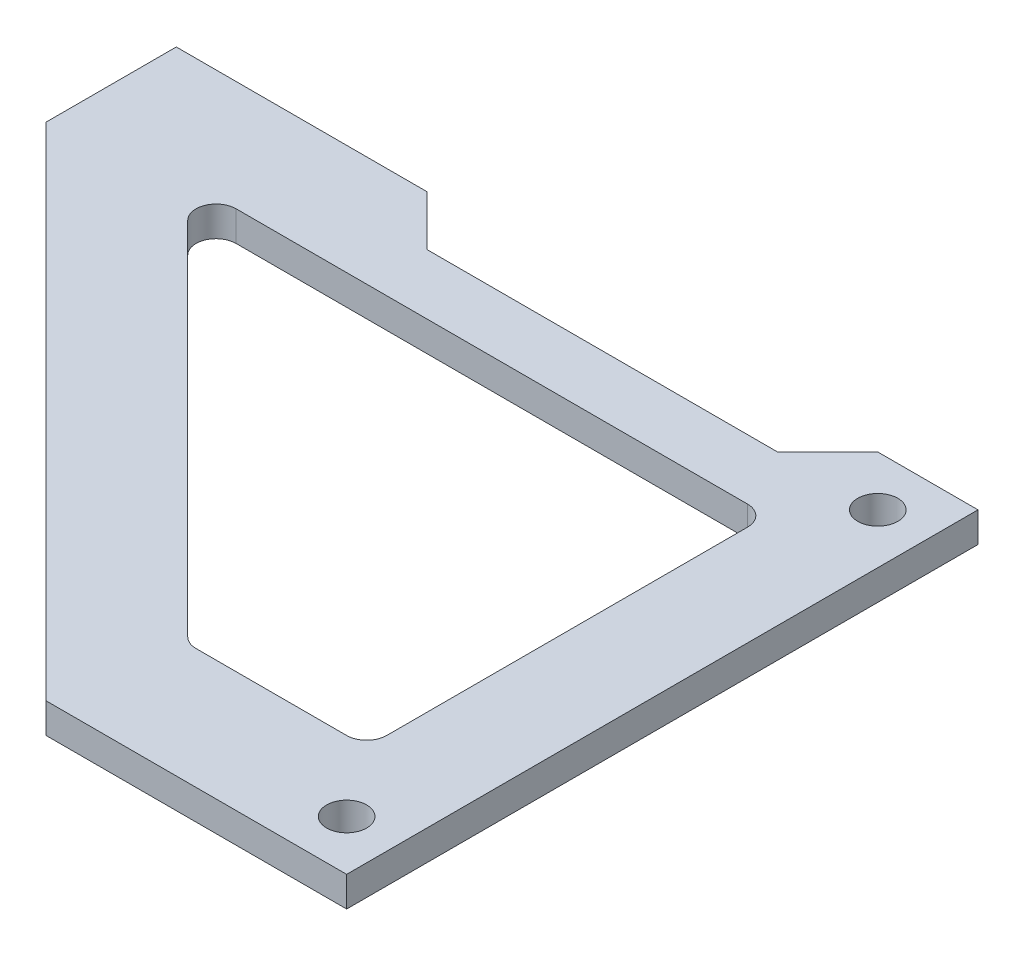
ISO-10303-21;
HEADER;
FILE_DESCRIPTION(('STEP AP214'),'2;1');
FILE_NAME('part.step','',(''),(''),'','','');
FILE_SCHEMA(('AUTOMOTIVE_DESIGN { 1 0 10303 214 1 1 1 1 }'));
ENDSEC;
DATA;
#1=APPLICATION_CONTEXT('core data for automotive mechanical design processes');
#2=APPLICATION_PROTOCOL_DEFINITION('international standard','automotive_design',2000,#1);
#3=PRODUCT_CONTEXT('',#1,'mechanical');
#4=PRODUCT('Part','Part','',(#3));
#5=PRODUCT_RELATED_PRODUCT_CATEGORY('part','',(#4));
#6=PRODUCT_DEFINITION_FORMATION('','',#4);
#7=PRODUCT_DEFINITION_CONTEXT('part definition',#1,'design');
#8=PRODUCT_DEFINITION('design','',#6,#7);
#9=PRODUCT_DEFINITION_SHAPE('','',#8);
#10=(LENGTH_UNIT() NAMED_UNIT(*) SI_UNIT(.MILLI.,.METRE.));
#11=(NAMED_UNIT(*) PLANE_ANGLE_UNIT() SI_UNIT($,.RADIAN.));
#12=(NAMED_UNIT(*) SI_UNIT($,.STERADIAN.) SOLID_ANGLE_UNIT());
#13=UNCERTAINTY_MEASURE_WITH_UNIT(LENGTH_MEASURE(1.E-05),#10,'distance_accuracy_value','');
#14=(GEOMETRIC_REPRESENTATION_CONTEXT(3) GLOBAL_UNCERTAINTY_ASSIGNED_CONTEXT((#13)) GLOBAL_UNIT_ASSIGNED_CONTEXT((#10,
#11,#12)) REPRESENTATION_CONTEXT('',''));
#15=CARTESIAN_POINT('',(0.,0.,0.));
#16=DIRECTION('',(0.,0.,1.));
#17=DIRECTION('',(1.,0.,0.));
#18=AXIS2_PLACEMENT_3D('',#15,#16,#17);
#19=CARTESIAN_POINT('',(-140.,3.,-31.5));
#20=DIRECTION('',(0.,0.,1.));
#21=DIRECTION('',(1.,0.,0.));
#22=AXIS2_PLACEMENT_3D('',#19,#20,#21);
#23=PLANE('',#22);
#24=DIRECTION('',(0.,1.,0.));
#25=VECTOR('',#24,1.);
#26=CARTESIAN_POINT('',(-115.,-7.,-31.5));
#27=LINE('',#26,#25);
#28=CARTESIAN_POINT('',(-115.,0.,-31.5));
#29=VERTEX_POINT('',#28);
#30=CARTESIAN_POINT('',(-115.,3.,-31.5));
#31=VERTEX_POINT('',#30);
#32=EDGE_CURVE('E161',#29,#31,#27,.T.);
#33=ORIENTED_EDGE('',*,*,#32,.F.);
#34=DIRECTION('',(-1.,0.,0.));
#35=VECTOR('',#34,1.);
#36=CARTESIAN_POINT('',(-140.,0.,-31.5));
#37=LINE('',#36,#35);
#38=CARTESIAN_POINT('',(-140.,0.,-31.5));
#39=VERTEX_POINT('',#38);
#40=EDGE_CURVE('E210',#29,#39,#37,.T.);
#41=ORIENTED_EDGE('',*,*,#40,.T.);
#42=DIRECTION('',(0.,-1.,0.));
#43=VECTOR('',#42,1.);
#44=CARTESIAN_POINT('',(-140.,3.,-31.5));
#45=LINE('',#44,#43);
#46=CARTESIAN_POINT('',(-140.,3.,-31.5));
#47=VERTEX_POINT('',#46);
#48=EDGE_CURVE('E188',#47,#39,#45,.T.);
#49=ORIENTED_EDGE('',*,*,#48,.F.);
#50=DIRECTION('',(-1.,0.,0.));
#51=VECTOR('',#50,1.);
#52=CARTESIAN_POINT('',(-140.,3.,-31.5));
#53=LINE('',#52,#51);
#54=EDGE_CURVE('E178',#31,#47,#53,.T.);
#55=ORIENTED_EDGE('',*,*,#54,.F.);
#56=EDGE_LOOP('',(#33,#41,#49,#55));
#57=FACE_BOUND('',#56,.T.);
#58=ADVANCED_FACE('F41',(#57),#23,.F.);
#59=CARTESIAN_POINT('',(-60.,0.,-31.5));
#60=VERTEX_POINT('',#59);
#61=CARTESIAN_POINT('',(-70.,0.,-31.5));
#62=VERTEX_POINT('',#61);
#63=EDGE_CURVE('E204',#60,#62,#37,.T.);
#64=ORIENTED_EDGE('',*,*,#63,.T.);
#65=DIRECTION('',(0.,1.,0.));
#66=VECTOR('',#65,1.);
#67=CARTESIAN_POINT('',(-70.,-7.,-31.5));
#68=LINE('',#67,#66);
#69=CARTESIAN_POINT('',(-70.,3.,-31.5));
#70=VERTEX_POINT('',#69);
#71=EDGE_CURVE('E304',#62,#70,#68,.T.);
#72=ORIENTED_EDGE('',*,*,#71,.T.);
#73=CARTESIAN_POINT('',(-60.,3.,-31.5));
#74=VERTEX_POINT('',#73);
#75=EDGE_CURVE('E186',#74,#70,#53,.T.);
#76=ORIENTED_EDGE('',*,*,#75,.F.);
#77=DIRECTION('',(0.,1.,0.));
#78=VECTOR('',#77,1.);
#79=CARTESIAN_POINT('',(-60.,-7.,-31.5));
#80=LINE('',#79,#78);
#81=EDGE_CURVE('E311',#60,#74,#80,.T.);
#82=ORIENTED_EDGE('',*,*,#81,.F.);
#83=EDGE_LOOP('',(#64,#72,#76,#82));
#84=FACE_BOUND('',#83,.T.);
#85=ADVANCED_FACE('F360',(#84),#23,.F.);
#86=CARTESIAN_POINT('',(-140.,3.,31.5));
#87=DIRECTION('',(0.,0.,-1.));
#88=DIRECTION('',(-1.,0.,0.));
#89=AXIS2_PLACEMENT_3D('',#86,#87,#88);
#90=PLANE('',#89);
#91=DIRECTION('',(1.,0.,0.));
#92=VECTOR('',#91,1.);
#93=CARTESIAN_POINT('',(-140.,0.,31.5));
#94=LINE('',#93,#92);
#95=CARTESIAN_POINT('',(-90.,0.,31.5));
#96=VERTEX_POINT('',#95);
#97=CARTESIAN_POINT('',(-60.,0.,31.5));
#98=VERTEX_POINT('',#97);
#99=EDGE_CURVE('E189',#96,#98,#94,.T.);
#100=ORIENTED_EDGE('',*,*,#99,.T.);
#101=DIRECTION('',(0.,1.,0.));
#102=VECTOR('',#101,1.);
#103=CARTESIAN_POINT('',(-60.,-7.,31.5));
#104=LINE('',#103,#102);
#105=CARTESIAN_POINT('',(-60.,3.,31.5));
#106=VERTEX_POINT('',#105);
#107=EDGE_CURVE('E315',#98,#106,#104,.T.);
#108=ORIENTED_EDGE('',*,*,#107,.T.);
#109=DIRECTION('',(1.,0.,0.));
#110=VECTOR('',#109,1.);
#111=CARTESIAN_POINT('',(-140.,3.,31.5));
#112=LINE('',#111,#110);
#113=CARTESIAN_POINT('',(-90.,3.,31.5));
#114=VERTEX_POINT('',#113);
#115=EDGE_CURVE('E203',#114,#106,#112,.T.);
#116=ORIENTED_EDGE('',*,*,#115,.F.);
#117=DIRECTION('',(0.,1.,0.));
#118=VECTOR('',#117,1.);
#119=CARTESIAN_POINT('',(-90.,0.,31.5));
#120=LINE('',#119,#118);
#121=EDGE_CURVE('E323',#96,#114,#120,.T.);
#122=ORIENTED_EDGE('',*,*,#121,.F.);
#123=EDGE_LOOP('',(#100,#108,#116,#122));
#124=FACE_BOUND('',#123,.T.);
#125=ADVANCED_FACE('F361',(#124),#90,.F.);
#126=CARTESIAN_POINT('',(0.,3.,0.));
#127=DIRECTION('',(0.,1.,0.));
#128=DIRECTION('',(0.,0.,1.));
#129=AXIS2_PLACEMENT_3D('',#126,#127,#128);
#130=PLANE('',#129);
#131=DIRECTION('',(0.,0.,-1.));
#132=VECTOR('',#131,1.);
#133=CARTESIAN_POINT('',(-70.,3.,-20.5));
#134=LINE('',#133,#132);
#135=CARTESIAN_POINT('',(-70.,3.,17.5));
#136=VERTEX_POINT('',#135);
#137=CARTESIAN_POINT('',(-70.,3.,-18.5));
#138=VERTEX_POINT('',#137);
#139=EDGE_CURVE('E274',#136,#138,#134,.T.);
#140=ORIENTED_EDGE('',*,*,#139,.F.);
#141=CARTESIAN_POINT('',(-72.,3.,17.5));
#142=DIRECTION('',(0.,1.,0.));
#143=DIRECTION('',(0.,0.,1.));
#144=AXIS2_PLACEMENT_3D('',#141,#142,#143);
#145=CIRCLE('',#144,2.);
#146=CARTESIAN_POINT('',(-72.,3.,19.5));
#147=VERTEX_POINT('',#146);
#148=EDGE_CURVE('E256',#136,#147,#145,.F.);
#149=ORIENTED_EDGE('',*,*,#148,.T.);
#150=DIRECTION('',(1.,0.,0.));
#151=VECTOR('',#150,1.);
#152=CARTESIAN_POINT('',(-70.,3.,19.5));
#153=LINE('',#152,#151);
#154=CARTESIAN_POINT('',(-87.0294372515229,3.,19.5));
#155=VERTEX_POINT('',#154);
#156=EDGE_CURVE('E181',#155,#147,#153,.T.);
#157=ORIENTED_EDGE('',*,*,#156,.F.);
#158=CARTESIAN_POINT('',(-87.0294372515229,3.,17.5));
#159=DIRECTION('',(0.,1.,0.));
#160=DIRECTION('',(0.,0.,1.));
#161=AXIS2_PLACEMENT_3D('',#158,#159,#160);
#162=CIRCLE('',#161,2.);
#163=CARTESIAN_POINT('',(-88.4436508138959,3.,18.9142135623731));
#164=VERTEX_POINT('',#163);
#165=EDGE_CURVE('E246',#155,#164,#162,.F.);
#166=ORIENTED_EDGE('',*,*,#165,.T.);
#167=DIRECTION('',(0.707106781186548,0.,0.707106781186547));
#168=VECTOR('',#167,1.);
#169=CARTESIAN_POINT('',(-87.857864376269,3.,19.5));
#170=LINE('',#169,#168);
#171=CARTESIAN_POINT('',(-124.443650813896,3.,-17.0857864376269));
#172=VERTEX_POINT('',#171);
#173=EDGE_CURVE('E270',#172,#164,#170,.T.);
#174=ORIENTED_EDGE('',*,*,#173,.F.);
#175=CARTESIAN_POINT('',(-123.029437251523,3.,-18.5));
#176=DIRECTION('',(0.,1.,0.));
#177=DIRECTION('',(0.,0.,1.));
#178=AXIS2_PLACEMENT_3D('',#175,#176,#177);
#179=CIRCLE('',#178,2.);
#180=CARTESIAN_POINT('',(-123.029437251523,3.,-20.5));
#181=VERTEX_POINT('',#180);
#182=EDGE_CURVE('E47',#172,#181,#179,.F.);
#183=ORIENTED_EDGE('',*,*,#182,.T.);
#184=DIRECTION('',(-1.,0.,0.));
#185=VECTOR('',#184,1.);
#186=CARTESIAN_POINT('',(-127.857864376269,3.,-20.5));
#187=LINE('',#186,#185);
#188=CARTESIAN_POINT('',(-72.,3.,-20.5));
#189=VERTEX_POINT('',#188);
#190=EDGE_CURVE('E264',#189,#181,#187,.T.);
#191=ORIENTED_EDGE('',*,*,#190,.F.);
#192=CARTESIAN_POINT('',(-72.,3.,-18.5));
#193=DIRECTION('',(0.,1.,0.));
#194=DIRECTION('',(0.,0.,1.));
#195=AXIS2_PLACEMENT_3D('',#192,#193,#194);
#196=CIRCLE('',#195,2.);
#197=EDGE_CURVE('E255',#189,#138,#196,.F.);
#198=ORIENTED_EDGE('',*,*,#197,.T.);
#199=EDGE_LOOP('',(#140,#149,#157,#166,#174,#183,#191,#198));
#200=FACE_BOUND('',#199,.T.);
#201=DIRECTION('',(0.707106781186547,0.,0.707106781186548));
#202=VECTOR('',#201,1.);
#203=CARTESIAN_POINT('',(-115.,3.,-31.5));
#204=LINE('',#203,#202);
#205=CARTESIAN_POINT('',(-110.,3.,-26.5));
#206=VERTEX_POINT('',#205);
#207=EDGE_CURVE('E163',#31,#206,#204,.T.);
#208=ORIENTED_EDGE('',*,*,#207,.F.);
#209=ORIENTED_EDGE('',*,*,#54,.T.);
#210=DIRECTION('',(0.,0.,1.));
#211=VECTOR('',#210,1.);
#212=CARTESIAN_POINT('',(-140.,3.,-31.5));
#213=LINE('',#212,#211);
#214=CARTESIAN_POINT('',(-140.,3.,-18.5));
#215=VERTEX_POINT('',#214);
#216=EDGE_CURVE('E195',#47,#215,#213,.T.);
#217=ORIENTED_EDGE('',*,*,#216,.T.);
#218=DIRECTION('',(-0.707106781186548,0.,-0.707106781186547));
#219=VECTOR('',#218,1.);
#220=CARTESIAN_POINT('',(-90.,3.,31.5));
#221=LINE('',#220,#219);
#222=EDGE_CURVE('E312',#114,#215,#221,.T.);
#223=ORIENTED_EDGE('',*,*,#222,.F.);
#224=ORIENTED_EDGE('',*,*,#115,.T.);
#225=DIRECTION('',(0.,0.,1.));
#226=VECTOR('',#225,1.);
#227=CARTESIAN_POINT('',(-60.,3.,-31.5));
#228=LINE('',#227,#226);
#229=EDGE_CURVE('E307',#74,#106,#228,.T.);
#230=ORIENTED_EDGE('',*,*,#229,.F.);
#231=ORIENTED_EDGE('',*,*,#75,.T.);
#232=DIRECTION('',(0.707106781186546,0.,-0.707106781186549));
#233=VECTOR('',#232,1.);
#234=CARTESIAN_POINT('',(-75.,3.,-26.5));
#235=LINE('',#234,#233);
#236=CARTESIAN_POINT('',(-75.,3.,-26.5));
#237=VERTEX_POINT('',#236);
#238=EDGE_CURVE('E175',#237,#70,#235,.T.);
#239=ORIENTED_EDGE('',*,*,#238,.F.);
#240=DIRECTION('',(1.,0.,0.));
#241=VECTOR('',#240,1.);
#242=CARTESIAN_POINT('',(-110.,3.,-26.5));
#243=LINE('',#242,#241);
#244=EDGE_CURVE('E185',#206,#237,#243,.T.);
#245=ORIENTED_EDGE('',*,*,#244,.F.);
#246=EDGE_LOOP('',(#208,#209,#217,#223,#224,#230,#231,#239,#245));
#247=FACE_BOUND('',#246,.T.);
#248=CARTESIAN_POINT('',(-65.,3.,-26.5));
#249=DIRECTION('',(0.,1.,0.));
#250=DIRECTION('',(0.,0.,1.));
#251=AXIS2_PLACEMENT_3D('',#248,#249,#250);
#252=CIRCLE('',#251,2.);
#253=CARTESIAN_POINT('',(-65.,3.,-24.5));
#254=VERTEX_POINT('',#253);
#255=EDGE_CURVE('E335',#254,#254,#252,.T.);
#256=ORIENTED_EDGE('',*,*,#255,.F.);
#257=EDGE_LOOP('',(#256));
#258=FACE_BOUND('',#257,.T.);
#259=CARTESIAN_POINT('',(-65.,3.,26.5));
#260=DIRECTION('',(0.,1.,0.));
#261=DIRECTION('',(0.,0.,1.));
#262=AXIS2_PLACEMENT_3D('',#259,#260,#261);
#263=CIRCLE('',#262,2.);
#264=CARTESIAN_POINT('',(-65.,3.,28.5));
#265=VERTEX_POINT('',#264);
#266=EDGE_CURVE('E327',#265,#265,#263,.T.);
#267=ORIENTED_EDGE('',*,*,#266,.F.);
#268=EDGE_LOOP('',(#267));
#269=FACE_BOUND('',#268,.T.);
#270=ADVANCED_FACE('F172',(#200,#247,#258,#269),#130,.T.);
#271=CARTESIAN_POINT('',(0.,0.,0.));
#272=DIRECTION('',(0.,1.,0.));
#273=DIRECTION('',(0.,0.,1.));
#274=AXIS2_PLACEMENT_3D('',#271,#272,#273);
#275=PLANE('',#274);
#276=DIRECTION('',(0.707106781186548,0.,0.707106781186547));
#277=VECTOR('',#276,1.);
#278=CARTESIAN_POINT('',(-53.6789321881345,0.,53.6789321881345));
#279=LINE('',#278,#277);
#280=CARTESIAN_POINT('',(-124.443650813896,0.,-17.0857864376269));
#281=VERTEX_POINT('',#280);
#282=CARTESIAN_POINT('',(-88.443650813896,0.,18.9142135623731));
#283=VERTEX_POINT('',#282);
#284=EDGE_CURVE('E221',#281,#283,#279,.T.);
#285=ORIENTED_EDGE('',*,*,#284,.T.);
#286=CARTESIAN_POINT('',(-87.0294372515229,0.,17.5));
#287=DIRECTION('',(0.,1.,0.));
#288=DIRECTION('',(0.,0.,1.));
#289=AXIS2_PLACEMENT_3D('',#286,#287,#288);
#290=CIRCLE('',#289,2.);
#291=CARTESIAN_POINT('',(-87.0294372515229,0.,19.5));
#292=VERTEX_POINT('',#291);
#293=EDGE_CURVE('E252',#283,#292,#290,.T.);
#294=ORIENTED_EDGE('',*,*,#293,.T.);
#295=DIRECTION('',(1.,0.,0.));
#296=VECTOR('',#295,1.);
#297=CARTESIAN_POINT('',(0.,0.,19.5));
#298=LINE('',#297,#296);
#299=CARTESIAN_POINT('',(-72.,0.,19.5));
#300=VERTEX_POINT('',#299);
#301=EDGE_CURVE('E230',#292,#300,#298,.T.);
#302=ORIENTED_EDGE('',*,*,#301,.T.);
#303=CARTESIAN_POINT('',(-72.,0.,17.5));
#304=DIRECTION('',(0.,1.,0.));
#305=DIRECTION('',(0.,0.,1.));
#306=AXIS2_PLACEMENT_3D('',#303,#304,#305);
#307=CIRCLE('',#306,2.);
#308=CARTESIAN_POINT('',(-70.,0.,17.5));
#309=VERTEX_POINT('',#308);
#310=EDGE_CURVE('E61',#300,#309,#307,.T.);
#311=ORIENTED_EDGE('',*,*,#310,.T.);
#312=DIRECTION('',(0.,0.,-1.));
#313=VECTOR('',#312,1.);
#314=CARTESIAN_POINT('',(-70.,0.,0.));
#315=LINE('',#314,#313);
#316=CARTESIAN_POINT('',(-70.,0.,-18.5));
#317=VERTEX_POINT('',#316);
#318=EDGE_CURVE('E229',#309,#317,#315,.T.);
#319=ORIENTED_EDGE('',*,*,#318,.T.);
#320=CARTESIAN_POINT('',(-72.,0.,-18.5));
#321=DIRECTION('',(0.,1.,0.));
#322=DIRECTION('',(0.,0.,1.));
#323=AXIS2_PLACEMENT_3D('',#320,#321,#322);
#324=CIRCLE('',#323,2.);
#325=CARTESIAN_POINT('',(-72.,0.,-20.5));
#326=VERTEX_POINT('',#325);
#327=EDGE_CURVE('E258',#317,#326,#324,.T.);
#328=ORIENTED_EDGE('',*,*,#327,.T.);
#329=DIRECTION('',(-1.,0.,0.));
#330=VECTOR('',#329,1.);
#331=CARTESIAN_POINT('',(0.,0.,-20.5));
#332=LINE('',#331,#330);
#333=CARTESIAN_POINT('',(-123.029437251523,0.,-20.5));
#334=VERTEX_POINT('',#333);
#335=EDGE_CURVE('E222',#326,#334,#332,.T.);
#336=ORIENTED_EDGE('',*,*,#335,.T.);
#337=CARTESIAN_POINT('',(-123.029437251523,0.,-18.5));
#338=DIRECTION('',(0.,1.,0.));
#339=DIRECTION('',(0.,0.,1.));
#340=AXIS2_PLACEMENT_3D('',#337,#338,#339);
#341=CIRCLE('',#340,2.);
#342=EDGE_CURVE('E11',#334,#281,#341,.T.);
#343=ORIENTED_EDGE('',*,*,#342,.T.);
#344=EDGE_LOOP('',(#285,#294,#302,#311,#319,#328,#336,#343));
#345=FACE_BOUND('',#344,.T.);
#346=DIRECTION('',(1.,0.,0.));
#347=VECTOR('',#346,1.);
#348=CARTESIAN_POINT('',(0.,0.,-26.5));
#349=LINE('',#348,#347);
#350=CARTESIAN_POINT('',(-110.,0.,-26.5));
#351=VERTEX_POINT('',#350);
#352=CARTESIAN_POINT('',(-75.,0.,-26.5));
#353=VERTEX_POINT('',#352);
#354=EDGE_CURVE('E214',#351,#353,#349,.T.);
#355=ORIENTED_EDGE('',*,*,#354,.T.);
#356=DIRECTION('',(0.707106781186546,0.,-0.707106781186549));
#357=VECTOR('',#356,1.);
#358=CARTESIAN_POINT('',(-50.7500000000002,0.,-50.7499999999999));
#359=LINE('',#358,#357);
#360=EDGE_CURVE('E217',#353,#62,#359,.T.);
#361=ORIENTED_EDGE('',*,*,#360,.T.);
#362=ORIENTED_EDGE('',*,*,#63,.F.);
#363=DIRECTION('',(0.,0.,1.));
#364=VECTOR('',#363,1.);
#365=CARTESIAN_POINT('',(-60.,0.,0.));
#366=LINE('',#365,#364);
#367=EDGE_CURVE('E211',#60,#98,#366,.T.);
#368=ORIENTED_EDGE('',*,*,#367,.T.);
#369=ORIENTED_EDGE('',*,*,#99,.F.);
#370=DIRECTION('',(-0.707106781186548,0.,-0.707106781186547));
#371=VECTOR('',#370,1.);
#372=CARTESIAN_POINT('',(-90.,0.,31.5));
#373=LINE('',#372,#371);
#374=CARTESIAN_POINT('',(-140.,0.,-18.5));
#375=VERTEX_POINT('',#374);
#376=EDGE_CURVE('E318',#96,#375,#373,.T.);
#377=ORIENTED_EDGE('',*,*,#376,.T.);
#378=DIRECTION('',(0.,0.,1.));
#379=VECTOR('',#378,1.);
#380=CARTESIAN_POINT('',(-140.,0.,-31.5));
#381=LINE('',#380,#379);
#382=EDGE_CURVE('E194',#39,#375,#381,.T.);
#383=ORIENTED_EDGE('',*,*,#382,.F.);
#384=ORIENTED_EDGE('',*,*,#40,.F.);
#385=DIRECTION('',(0.707106781186547,0.,0.707106781186548));
#386=VECTOR('',#385,1.);
#387=CARTESIAN_POINT('',(-41.7500000000001,0.,41.75));
#388=LINE('',#387,#386);
#389=EDGE_CURVE('E170',#29,#351,#388,.T.);
#390=ORIENTED_EDGE('',*,*,#389,.T.);
#391=EDGE_LOOP('',(#355,#361,#362,#368,#369,#377,#383,#384,#390));
#392=FACE_BOUND('',#391,.T.);
#393=CARTESIAN_POINT('',(-65.,0.,-26.5));
#394=DIRECTION('',(0.,1.,0.));
#395=DIRECTION('',(0.,0.,1.));
#396=AXIS2_PLACEMENT_3D('',#393,#394,#395);
#397=CIRCLE('',#396,2.);
#398=CARTESIAN_POINT('',(-65.,0.,-24.5));
#399=VERTEX_POINT('',#398);
#400=EDGE_CURVE('E196',#399,#399,#397,.T.);
#401=ORIENTED_EDGE('',*,*,#400,.T.);
#402=EDGE_LOOP('',(#401));
#403=FACE_BOUND('',#402,.T.);
#404=CARTESIAN_POINT('',(-65.,0.,26.5));
#405=DIRECTION('',(0.,1.,0.));
#406=DIRECTION('',(0.,0.,1.));
#407=AXIS2_PLACEMENT_3D('',#404,#405,#406);
#408=CIRCLE('',#407,2.);
#409=CARTESIAN_POINT('',(-65.,0.,28.5));
#410=VERTEX_POINT('',#409);
#411=EDGE_CURVE('E324',#410,#410,#408,.T.);
#412=ORIENTED_EDGE('',*,*,#411,.T.);
#413=EDGE_LOOP('',(#412));
#414=FACE_BOUND('',#413,.T.);
#415=ADVANCED_FACE('F276',(#345,#392,#403,#414),#275,.F.);
#416=CARTESIAN_POINT('',(-140.,3.,-31.5));
#417=DIRECTION('',(1.,0.,0.));
#418=DIRECTION('',(0.,0.,-1.));
#419=AXIS2_PLACEMENT_3D('',#416,#417,#418);
#420=PLANE('',#419);
#421=ORIENTED_EDGE('',*,*,#382,.T.);
#422=DIRECTION('',(0.,1.,0.));
#423=VECTOR('',#422,1.);
#424=CARTESIAN_POINT('',(-140.,0.,-18.5));
#425=LINE('',#424,#423);
#426=EDGE_CURVE('E321',#375,#215,#425,.T.);
#427=ORIENTED_EDGE('',*,*,#426,.T.);
#428=ORIENTED_EDGE('',*,*,#216,.F.);
#429=ORIENTED_EDGE('',*,*,#48,.T.);
#430=EDGE_LOOP('',(#421,#427,#428,#429));
#431=FACE_BOUND('',#430,.T.);
#432=ADVANCED_FACE('F344',(#431),#420,.F.);
#433=CARTESIAN_POINT('',(-65.,3.,-26.5));
#434=DIRECTION('',(0.,-1.,0.));
#435=DIRECTION('',(0.,0.,-1.));
#436=AXIS2_PLACEMENT_3D('',#433,#434,#435);
#437=CYLINDRICAL_SURFACE('',#436,2.);
#438=ORIENTED_EDGE('',*,*,#255,.T.);
#439=EDGE_LOOP('',(#438));
#440=FACE_BOUND('',#439,.T.);
#441=ORIENTED_EDGE('',*,*,#400,.F.);
#442=EDGE_LOOP('',(#441));
#443=FACE_BOUND('',#442,.T.);
#444=ADVANCED_FACE('F342',(#440,#443),#437,.F.);
#445=CARTESIAN_POINT('',(-65.,3.,26.5));
#446=DIRECTION('',(0.,-1.,0.));
#447=DIRECTION('',(0.,0.,-1.));
#448=AXIS2_PLACEMENT_3D('',#445,#446,#447);
#449=CYLINDRICAL_SURFACE('',#448,2.);
#450=ORIENTED_EDGE('',*,*,#266,.T.);
#451=EDGE_LOOP('',(#450));
#452=FACE_BOUND('',#451,.T.);
#453=ORIENTED_EDGE('',*,*,#411,.F.);
#454=EDGE_LOOP('',(#453));
#455=FACE_BOUND('',#454,.T.);
#456=ADVANCED_FACE('F343',(#452,#455),#449,.F.);
#457=CARTESIAN_POINT('',(-90.,0.,31.5));
#458=DIRECTION('',(0.707106781186547,0.,-0.707106781186548));
#459=DIRECTION('',(-0.707106781186548,0.,-0.707106781186547));
#460=AXIS2_PLACEMENT_3D('',#457,#458,#459);
#461=PLANE('',#460);
#462=ORIENTED_EDGE('',*,*,#222,.T.);
#463=ORIENTED_EDGE('',*,*,#426,.F.);
#464=ORIENTED_EDGE('',*,*,#376,.F.);
#465=ORIENTED_EDGE('',*,*,#121,.T.);
#466=EDGE_LOOP('',(#462,#463,#464,#465));
#467=FACE_BOUND('',#466,.T.);
#468=ADVANCED_FACE('F349',(#467),#461,.F.);
#469=CARTESIAN_POINT('',(-60.,-7.,-31.5));
#470=DIRECTION('',(-1.,0.,0.));
#471=DIRECTION('',(0.,0.,1.));
#472=AXIS2_PLACEMENT_3D('',#469,#470,#471);
#473=PLANE('',#472);
#474=ORIENTED_EDGE('',*,*,#81,.T.);
#475=ORIENTED_EDGE('',*,*,#229,.T.);
#476=ORIENTED_EDGE('',*,*,#107,.F.);
#477=ORIENTED_EDGE('',*,*,#367,.F.);
#478=EDGE_LOOP('',(#474,#475,#476,#477));
#479=FACE_BOUND('',#478,.T.);
#480=ADVANCED_FACE('F457',(#479),#473,.F.);
#481=CARTESIAN_POINT('',(-75.,-7.,-26.5));
#482=DIRECTION('',(0.707106781186549,0.,0.707106781186546));
#483=DIRECTION('',(0.707106781186546,0.,-0.707106781186549));
#484=AXIS2_PLACEMENT_3D('',#481,#482,#483);
#485=PLANE('',#484);
#486=DIRECTION('',(0.,1.,0.));
#487=VECTOR('',#486,1.);
#488=CARTESIAN_POINT('',(-75.,-7.,-26.5));
#489=LINE('',#488,#487);
#490=EDGE_CURVE('E306',#353,#237,#489,.T.);
#491=ORIENTED_EDGE('',*,*,#490,.T.);
#492=ORIENTED_EDGE('',*,*,#238,.T.);
#493=ORIENTED_EDGE('',*,*,#71,.F.);
#494=ORIENTED_EDGE('',*,*,#360,.F.);
#495=EDGE_LOOP('',(#491,#492,#493,#494));
#496=FACE_BOUND('',#495,.T.);
#497=ADVANCED_FACE('F450',(#496),#485,.F.);
#498=CARTESIAN_POINT('',(-110.,-7.,-26.5));
#499=DIRECTION('',(0.,0.,1.));
#500=DIRECTION('',(1.,0.,0.));
#501=AXIS2_PLACEMENT_3D('',#498,#499,#500);
#502=PLANE('',#501);
#503=DIRECTION('',(0.,1.,0.));
#504=VECTOR('',#503,1.);
#505=CARTESIAN_POINT('',(-110.,-7.,-26.5));
#506=LINE('',#505,#504);
#507=EDGE_CURVE('E173',#351,#206,#506,.T.);
#508=ORIENTED_EDGE('',*,*,#507,.T.);
#509=ORIENTED_EDGE('',*,*,#244,.T.);
#510=ORIENTED_EDGE('',*,*,#490,.F.);
#511=ORIENTED_EDGE('',*,*,#354,.F.);
#512=EDGE_LOOP('',(#508,#509,#510,#511));
#513=FACE_BOUND('',#512,.T.);
#514=ADVANCED_FACE('F440',(#513),#502,.F.);
#515=CARTESIAN_POINT('',(-115.,-7.,-31.5));
#516=DIRECTION('',(-0.707106781186548,0.,0.707106781186547));
#517=DIRECTION('',(0.707106781186547,0.,0.707106781186548));
#518=AXIS2_PLACEMENT_3D('',#515,#516,#517);
#519=PLANE('',#518);
#520=ORIENTED_EDGE('',*,*,#32,.T.);
#521=ORIENTED_EDGE('',*,*,#207,.T.);
#522=ORIENTED_EDGE('',*,*,#507,.F.);
#523=ORIENTED_EDGE('',*,*,#389,.F.);
#524=EDGE_LOOP('',(#520,#521,#522,#523));
#525=FACE_BOUND('',#524,.T.);
#526=ADVANCED_FACE('F162',(#525),#519,.F.);
#527=CARTESIAN_POINT('',(-70.,-7.,-20.5));
#528=DIRECTION('',(1.,0.,0.));
#529=DIRECTION('',(0.,0.,-1.));
#530=AXIS2_PLACEMENT_3D('',#527,#528,#529);
#531=PLANE('',#530);
#532=ORIENTED_EDGE('',*,*,#139,.T.);
#533=DIRECTION('',(0.,1.,0.));
#534=VECTOR('',#533,1.);
#535=CARTESIAN_POINT('',(-70.,0.,-18.5));
#536=LINE('',#535,#534);
#537=EDGE_CURVE('E57',#138,#317,#536,.F.);
#538=ORIENTED_EDGE('',*,*,#537,.T.);
#539=ORIENTED_EDGE('',*,*,#318,.F.);
#540=DIRECTION('',(0.,1.,0.));
#541=VECTOR('',#540,1.);
#542=CARTESIAN_POINT('',(-70.,3.,17.5));
#543=LINE('',#542,#541);
#544=EDGE_CURVE('E247',#309,#136,#543,.T.);
#545=ORIENTED_EDGE('',*,*,#544,.T.);
#546=EDGE_LOOP('',(#532,#538,#539,#545));
#547=FACE_BOUND('',#546,.T.);
#548=ADVANCED_FACE('F300',(#547),#531,.F.);
#549=CARTESIAN_POINT('',(-70.,-7.,19.5));
#550=DIRECTION('',(0.,0.,1.));
#551=DIRECTION('',(1.,0.,0.));
#552=AXIS2_PLACEMENT_3D('',#549,#550,#551);
#553=PLANE('',#552);
#554=ORIENTED_EDGE('',*,*,#301,.F.);
#555=DIRECTION('',(0.,1.,0.));
#556=VECTOR('',#555,1.);
#557=CARTESIAN_POINT('',(-87.0294372515229,3.,19.5));
#558=LINE('',#557,#556);
#559=EDGE_CURVE('E233',#292,#155,#558,.T.);
#560=ORIENTED_EDGE('',*,*,#559,.T.);
#561=ORIENTED_EDGE('',*,*,#156,.T.);
#562=DIRECTION('',(0.,1.,0.));
#563=VECTOR('',#562,1.);
#564=CARTESIAN_POINT('',(-72.,0.,19.5));
#565=LINE('',#564,#563);
#566=EDGE_CURVE('E232',#147,#300,#565,.F.);
#567=ORIENTED_EDGE('',*,*,#566,.T.);
#568=EDGE_LOOP('',(#554,#560,#561,#567));
#569=FACE_BOUND('',#568,.T.);
#570=ADVANCED_FACE('F286',(#569),#553,.F.);
#571=CARTESIAN_POINT('',(-87.857864376269,-7.,19.5));
#572=DIRECTION('',(-0.707106781186547,0.,0.707106781186548));
#573=DIRECTION('',(0.707106781186548,0.,0.707106781186547));
#574=AXIS2_PLACEMENT_3D('',#571,#572,#573);
#575=PLANE('',#574);
#576=ORIENTED_EDGE('',*,*,#173,.T.);
#577=DIRECTION('',(0.,1.,0.));
#578=VECTOR('',#577,1.);
#579=CARTESIAN_POINT('',(-88.4436508138959,0.,18.9142135623731));
#580=LINE('',#579,#578);
#581=EDGE_CURVE('E239',#164,#283,#580,.F.);
#582=ORIENTED_EDGE('',*,*,#581,.T.);
#583=ORIENTED_EDGE('',*,*,#284,.F.);
#584=DIRECTION('',(0.,1.,0.));
#585=VECTOR('',#584,1.);
#586=CARTESIAN_POINT('',(-124.443650813896,3.,-17.0857864376269));
#587=LINE('',#586,#585);
#588=EDGE_CURVE('E237',#281,#172,#587,.T.);
#589=ORIENTED_EDGE('',*,*,#588,.T.);
#590=EDGE_LOOP('',(#576,#582,#583,#589));
#591=FACE_BOUND('',#590,.T.);
#592=ADVANCED_FACE('F281',(#591),#575,.F.);
#593=CARTESIAN_POINT('',(-127.857864376269,-7.,-20.5));
#594=DIRECTION('',(0.,0.,-1.));
#595=DIRECTION('',(-1.,0.,0.));
#596=AXIS2_PLACEMENT_3D('',#593,#594,#595);
#597=PLANE('',#596);
#598=ORIENTED_EDGE('',*,*,#335,.F.);
#599=DIRECTION('',(0.,1.,0.));
#600=VECTOR('',#599,1.);
#601=CARTESIAN_POINT('',(-72.,3.,-20.5));
#602=LINE('',#601,#600);
#603=EDGE_CURVE('E241',#326,#189,#602,.T.);
#604=ORIENTED_EDGE('',*,*,#603,.T.);
#605=ORIENTED_EDGE('',*,*,#190,.T.);
#606=DIRECTION('',(0.,1.,0.));
#607=VECTOR('',#606,1.);
#608=CARTESIAN_POINT('',(-123.029437251523,0.,-20.5));
#609=LINE('',#608,#607);
#610=EDGE_CURVE('E243',#181,#334,#609,.F.);
#611=ORIENTED_EDGE('',*,*,#610,.T.);
#612=EDGE_LOOP('',(#598,#604,#605,#611));
#613=FACE_BOUND('',#612,.T.);
#614=ADVANCED_FACE('F272',(#613),#597,.F.);
#615=CARTESIAN_POINT('',(-87.0294372515229,-7.,17.5));
#616=DIRECTION('',(0.,-1.,0.));
#617=DIRECTION('',(0.,0.,-1.));
#618=AXIS2_PLACEMENT_3D('',#615,#616,#617);
#619=CYLINDRICAL_SURFACE('',#618,2.);
#620=ORIENTED_EDGE('',*,*,#293,.F.);
#621=ORIENTED_EDGE('',*,*,#581,.F.);
#622=ORIENTED_EDGE('',*,*,#165,.F.);
#623=ORIENTED_EDGE('',*,*,#559,.F.);
#624=EDGE_LOOP('',(#620,#621,#622,#623));
#625=FACE_BOUND('',#624,.T.);
#626=ADVANCED_FACE('F287',(#625),#619,.F.);
#627=CARTESIAN_POINT('',(-72.,-7.,-18.5));
#628=DIRECTION('',(0.,-1.,0.));
#629=DIRECTION('',(0.,0.,-1.));
#630=AXIS2_PLACEMENT_3D('',#627,#628,#629);
#631=CYLINDRICAL_SURFACE('',#630,2.);
#632=ORIENTED_EDGE('',*,*,#327,.F.);
#633=ORIENTED_EDGE('',*,*,#537,.F.);
#634=ORIENTED_EDGE('',*,*,#197,.F.);
#635=ORIENTED_EDGE('',*,*,#603,.F.);
#636=EDGE_LOOP('',(#632,#633,#634,#635));
#637=FACE_BOUND('',#636,.T.);
#638=ADVANCED_FACE('F369',(#637),#631,.F.);
#639=CARTESIAN_POINT('',(-72.,-7.,17.5));
#640=DIRECTION('',(0.,-1.,0.));
#641=DIRECTION('',(0.,0.,-1.));
#642=AXIS2_PLACEMENT_3D('',#639,#640,#641);
#643=CYLINDRICAL_SURFACE('',#642,2.);
#644=ORIENTED_EDGE('',*,*,#310,.F.);
#645=ORIENTED_EDGE('',*,*,#566,.F.);
#646=ORIENTED_EDGE('',*,*,#148,.F.);
#647=ORIENTED_EDGE('',*,*,#544,.F.);
#648=EDGE_LOOP('',(#644,#645,#646,#647));
#649=FACE_BOUND('',#648,.T.);
#650=ADVANCED_FACE('F293',(#649),#643,.F.);
#651=CARTESIAN_POINT('',(-123.029437251523,-7.,-18.5));
#652=DIRECTION('',(0.,-1.,0.));
#653=DIRECTION('',(0.,0.,-1.));
#654=AXIS2_PLACEMENT_3D('',#651,#652,#653);
#655=CYLINDRICAL_SURFACE('',#654,2.);
#656=ORIENTED_EDGE('',*,*,#342,.F.);
#657=ORIENTED_EDGE('',*,*,#610,.F.);
#658=ORIENTED_EDGE('',*,*,#182,.F.);
#659=ORIENTED_EDGE('',*,*,#588,.F.);
#660=EDGE_LOOP('',(#656,#657,#658,#659));
#661=FACE_BOUND('',#660,.T.);
#662=ADVANCED_FACE('F43',(#661),#655,.F.);
#663=CLOSED_SHELL('',(#58,#85,#125,#270,#415,#432,#444,#456,#468,#480,#497,#514,#526,#548,#570,
#592,#614,#626,#638,#650,#662));
#664=MANIFOLD_SOLID_BREP('B2',#663);
#665=ADVANCED_BREP_SHAPE_REPRESENTATION('',(#18,#664),#14);
#666=SHAPE_DEFINITION_REPRESENTATION(#9,#665);
ENDSEC;
END-ISO-10303-21;
